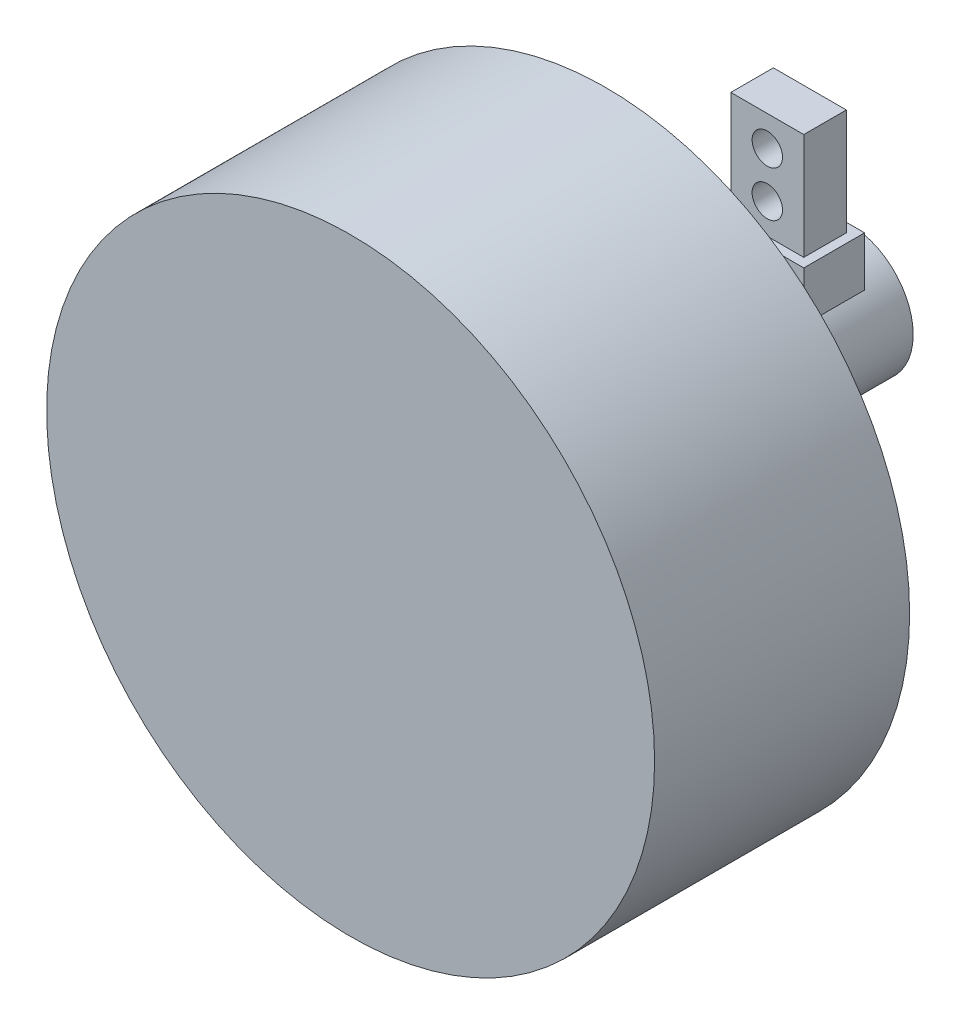
ISO-10303-21;
HEADER;
FILE_DESCRIPTION(('STEP AP214'),'2;1');
FILE_NAME('part.step','',(''),(''),'','','');
FILE_SCHEMA(('AUTOMOTIVE_DESIGN { 1 0 10303 214 1 1 1 1 }'));
ENDSEC;
DATA;
#1=APPLICATION_CONTEXT('core data for automotive mechanical design processes');
#2=APPLICATION_PROTOCOL_DEFINITION('international standard','automotive_design',2000,#1);
#3=PRODUCT_CONTEXT('',#1,'mechanical');
#4=PRODUCT('Part','Part','',(#3));
#5=PRODUCT_RELATED_PRODUCT_CATEGORY('part','',(#4));
#6=PRODUCT_DEFINITION_FORMATION('','',#4);
#7=PRODUCT_DEFINITION_CONTEXT('part definition',#1,'design');
#8=PRODUCT_DEFINITION('design','',#6,#7);
#9=PRODUCT_DEFINITION_SHAPE('','',#8);
#10=(LENGTH_UNIT() NAMED_UNIT(*) SI_UNIT(.MILLI.,.METRE.));
#11=(NAMED_UNIT(*) PLANE_ANGLE_UNIT() SI_UNIT($,.RADIAN.));
#12=(NAMED_UNIT(*) SI_UNIT($,.STERADIAN.) SOLID_ANGLE_UNIT());
#13=UNCERTAINTY_MEASURE_WITH_UNIT(LENGTH_MEASURE(1.E-05),#10,'distance_accuracy_value','');
#14=(GEOMETRIC_REPRESENTATION_CONTEXT(3) GLOBAL_UNCERTAINTY_ASSIGNED_CONTEXT((#13)) GLOBAL_UNIT_ASSIGNED_CONTEXT((#10,
#11,#12)) REPRESENTATION_CONTEXT('',''));
#15=CARTESIAN_POINT('',(0.,0.,0.));
#16=DIRECTION('',(0.,0.,1.));
#17=DIRECTION('',(1.,0.,0.));
#18=AXIS2_PLACEMENT_3D('',#15,#16,#17);
#19=CARTESIAN_POINT('',(-15.,65.985,-50.18));
#20=DIRECTION('',(1.,0.,0.));
#21=DIRECTION('',(0.,0.,-1.));
#22=AXIS2_PLACEMENT_3D('',#19,#20,#21);
#23=PLANE('',#22);
#24=DIRECTION('',(0.,0.,1.));
#25=VECTOR('',#24,1.);
#26=CARTESIAN_POINT('',(-15.,30.985,-70.18));
#27=LINE('',#26,#25);
#28=CARTESIAN_POINT('',(-15.,30.985,-70.18));
#29=VERTEX_POINT('',#28);
#30=CARTESIAN_POINT('',(-15.,30.985,-50.18));
#31=VERTEX_POINT('',#30);
#32=EDGE_CURVE('E142',#29,#31,#27,.T.);
#33=ORIENTED_EDGE('',*,*,#32,.F.);
#34=DIRECTION('',(0.,-1.,0.));
#35=VECTOR('',#34,1.);
#36=CARTESIAN_POINT('',(-15.,65.985,-70.18));
#37=LINE('',#36,#35);
#38=CARTESIAN_POINT('',(-15.,14.675497436203,-70.18));
#39=VERTEX_POINT('',#38);
#40=EDGE_CURVE('E159',#29,#39,#37,.T.);
#41=ORIENTED_EDGE('',*,*,#40,.T.);
#42=DIRECTION('',(0.,0.,1.));
#43=VECTOR('',#42,1.);
#44=CARTESIAN_POINT('',(-15.,14.675497436203,-80.18));
#45=LINE('',#44,#43);
#46=CARTESIAN_POINT('',(-15.,14.675497436203,-50.18));
#47=VERTEX_POINT('',#46);
#48=EDGE_CURVE('E160',#47,#39,#45,.F.);
#49=ORIENTED_EDGE('',*,*,#48,.F.);
#50=DIRECTION('',(0.,-1.,0.));
#51=VECTOR('',#50,1.);
#52=CARTESIAN_POINT('',(-15.,65.985,-50.18));
#53=LINE('',#52,#51);
#54=EDGE_CURVE('E170',#31,#47,#53,.T.);
#55=ORIENTED_EDGE('',*,*,#54,.F.);
#56=EDGE_LOOP('',(#33,#41,#49,#55));
#57=FACE_BOUND('',#56,.T.);
#58=ADVANCED_FACE('F36',(#57),#23,.F.);
#59=CARTESIAN_POINT('',(15.,65.985,-50.18));
#60=DIRECTION('',(0.,0.,-1.));
#61=DIRECTION('',(-1.,0.,0.));
#62=AXIS2_PLACEMENT_3D('',#59,#60,#61);
#63=PLANE('',#62);
#64=DIRECTION('',(1.,0.,0.));
#65=VECTOR('',#64,1.);
#66=CARTESIAN_POINT('',(-15.,30.985,-50.18));
#67=LINE('',#66,#65);
#68=CARTESIAN_POINT('',(15.,30.985,-50.18));
#69=VERTEX_POINT('',#68);
#70=EDGE_CURVE('E147',#31,#69,#67,.T.);
#71=ORIENTED_EDGE('',*,*,#70,.F.);
#72=ORIENTED_EDGE('',*,*,#54,.T.);
#73=CARTESIAN_POINT('',(0.,0.,-50.18));
#74=DIRECTION('',(0.,0.,1.));
#75=DIRECTION('',(1.,0.,0.));
#76=AXIS2_PLACEMENT_3D('',#73,#74,#75);
#77=CIRCLE('',#76,20.985);
#78=CARTESIAN_POINT('',(15.,14.675497436203,-50.18));
#79=VERTEX_POINT('',#78);
#80=EDGE_CURVE('E156',#79,#47,#77,.T.);
#81=ORIENTED_EDGE('',*,*,#80,.F.);
#82=DIRECTION('',(0.,-1.,0.));
#83=VECTOR('',#82,1.);
#84=CARTESIAN_POINT('',(15.,65.985,-50.18));
#85=LINE('',#84,#83);
#86=EDGE_CURVE('E168',#69,#79,#85,.T.);
#87=ORIENTED_EDGE('',*,*,#86,.F.);
#88=EDGE_LOOP('',(#71,#72,#81,#87));
#89=FACE_BOUND('',#88,.T.);
#90=ADVANCED_FACE('F194',(#89),#63,.F.);
#91=CARTESIAN_POINT('',(15.,65.985,-50.18));
#92=DIRECTION('',(-1.,0.,0.));
#93=DIRECTION('',(0.,0.,1.));
#94=AXIS2_PLACEMENT_3D('',#91,#92,#93);
#95=PLANE('',#94);
#96=DIRECTION('',(0.,0.,-1.));
#97=VECTOR('',#96,1.);
#98=CARTESIAN_POINT('',(15.,30.985,-70.18));
#99=LINE('',#98,#97);
#100=CARTESIAN_POINT('',(15.,30.985,-70.18));
#101=VERTEX_POINT('',#100);
#102=EDGE_CURVE('E51',#69,#101,#99,.T.);
#103=ORIENTED_EDGE('',*,*,#102,.F.);
#104=ORIENTED_EDGE('',*,*,#86,.T.);
#105=DIRECTION('',(0.,0.,1.));
#106=VECTOR('',#105,1.);
#107=CARTESIAN_POINT('',(15.,14.675497436203,-80.18));
#108=LINE('',#107,#106);
#109=CARTESIAN_POINT('',(15.,14.675497436203,-70.18));
#110=VERTEX_POINT('',#109);
#111=EDGE_CURVE('E152',#110,#79,#108,.T.);
#112=ORIENTED_EDGE('',*,*,#111,.F.);
#113=DIRECTION('',(0.,-1.,0.));
#114=VECTOR('',#113,1.);
#115=CARTESIAN_POINT('',(15.,65.985,-70.18));
#116=LINE('',#115,#114);
#117=EDGE_CURVE('E166',#101,#110,#116,.T.);
#118=ORIENTED_EDGE('',*,*,#117,.F.);
#119=EDGE_LOOP('',(#103,#104,#112,#118));
#120=FACE_BOUND('',#119,.T.);
#121=ADVANCED_FACE('F203',(#120),#95,.F.);
#122=CARTESIAN_POINT('',(15.,65.985,-70.18));
#123=DIRECTION('',(0.,0.,1.));
#124=DIRECTION('',(1.,0.,0.));
#125=AXIS2_PLACEMENT_3D('',#122,#123,#124);
#126=PLANE('',#125);
#127=DIRECTION('',(-1.,0.,0.));
#128=VECTOR('',#127,1.);
#129=CARTESIAN_POINT('',(-15.,30.985,-70.18));
#130=LINE('',#129,#128);
#131=EDGE_CURVE('E150',#101,#29,#130,.T.);
#132=ORIENTED_EDGE('',*,*,#131,.F.);
#133=ORIENTED_EDGE('',*,*,#117,.T.);
#134=CARTESIAN_POINT('',(0.,0.,-70.18));
#135=DIRECTION('',(0.,0.,-1.));
#136=DIRECTION('',(-1.,0.,0.));
#137=AXIS2_PLACEMENT_3D('',#134,#135,#136);
#138=CIRCLE('',#137,20.985);
#139=EDGE_CURVE('E155',#39,#110,#138,.T.);
#140=ORIENTED_EDGE('',*,*,#139,.F.);
#141=ORIENTED_EDGE('',*,*,#40,.F.);
#142=EDGE_LOOP('',(#132,#133,#140,#141));
#143=FACE_BOUND('',#142,.T.);
#144=ADVANCED_FACE('F185',(#143),#126,.F.);
#145=CARTESIAN_POINT('',(0.,0.,-80.18));
#146=DIRECTION('',(0.,0.,1.));
#147=DIRECTION('',(1.,0.,0.));
#148=AXIS2_PLACEMENT_3D('',#145,#146,#147);
#149=CYLINDRICAL_SURFACE('',#148,20.985);
#150=CARTESIAN_POINT('',(0.,0.,-80.18));
#151=DIRECTION('',(0.,0.,1.));
#152=DIRECTION('',(1.,0.,0.));
#153=AXIS2_PLACEMENT_3D('',#150,#151,#152);
#154=CIRCLE('',#153,20.985);
#155=CARTESIAN_POINT('',(20.985,0.,-80.18));
#156=VERTEX_POINT('',#155);
#157=EDGE_CURVE('E173',#156,#156,#154,.T.);
#158=ORIENTED_EDGE('',*,*,#157,.T.);
#159=EDGE_LOOP('',(#158));
#160=FACE_BOUND('',#159,.T.);
#161=CARTESIAN_POINT('',(0.,0.,0.));
#162=DIRECTION('',(0.,0.,1.));
#163=DIRECTION('',(1.,0.,0.));
#164=AXIS2_PLACEMENT_3D('',#161,#162,#163);
#165=CIRCLE('',#164,20.985);
#166=CARTESIAN_POINT('',(20.985,0.,0.));
#167=VERTEX_POINT('',#166);
#168=EDGE_CURVE('E172',#167,#167,#165,.T.);
#169=ORIENTED_EDGE('',*,*,#168,.F.);
#170=EDGE_LOOP('',(#169));
#171=FACE_BOUND('',#170,.T.);
#172=ORIENTED_EDGE('',*,*,#80,.T.);
#173=ORIENTED_EDGE('',*,*,#48,.T.);
#174=ORIENTED_EDGE('',*,*,#139,.T.);
#175=ORIENTED_EDGE('',*,*,#111,.T.);
#176=EDGE_LOOP('',(#172,#173,#174,#175));
#177=FACE_BOUND('',#176,.T.);
#178=ADVANCED_FACE('F182',(#160,#171,#177),#149,.T.);
#179=CARTESIAN_POINT('',(0.,0.,83.89));
#180=DIRECTION('',(0.,0.,-1.));
#181=DIRECTION('',(-1.,0.,0.));
#182=AXIS2_PLACEMENT_3D('',#179,#180,#181);
#183=CYLINDRICAL_SURFACE('',#182,100.);
#184=CARTESIAN_POINT('',(0.,0.,83.89));
#185=DIRECTION('',(0.,0.,1.));
#186=DIRECTION('',(1.,0.,0.));
#187=AXIS2_PLACEMENT_3D('',#184,#185,#186);
#188=CIRCLE('',#187,100.);
#189=CARTESIAN_POINT('',(100.,0.,83.89));
#190=VERTEX_POINT('',#189);
#191=EDGE_CURVE('E11',#190,#190,#188,.T.);
#192=ORIENTED_EDGE('',*,*,#191,.F.);
#193=EDGE_LOOP('',(#192));
#194=FACE_BOUND('',#193,.T.);
#195=CARTESIAN_POINT('',(0.,0.,0.));
#196=DIRECTION('',(0.,0.,1.));
#197=DIRECTION('',(1.,0.,0.));
#198=AXIS2_PLACEMENT_3D('',#195,#196,#197);
#199=CIRCLE('',#198,100.);
#200=CARTESIAN_POINT('',(100.,0.,0.));
#201=VERTEX_POINT('',#200);
#202=EDGE_CURVE('E40',#201,#201,#199,.T.);
#203=ORIENTED_EDGE('',*,*,#202,.T.);
#204=EDGE_LOOP('',(#203));
#205=FACE_BOUND('',#204,.T.);
#206=ADVANCED_FACE('F38',(#194,#205),#183,.T.);
#207=CARTESIAN_POINT('',(0.,0.,83.89));
#208=DIRECTION('',(0.,0.,1.));
#209=DIRECTION('',(1.,0.,0.));
#210=AXIS2_PLACEMENT_3D('',#207,#208,#209);
#211=PLANE('',#210);
#212=ORIENTED_EDGE('',*,*,#191,.T.);
#213=EDGE_LOOP('',(#212));
#214=FACE_BOUND('',#213,.T.);
#215=ADVANCED_FACE('F221',(#214),#211,.T.);
#216=CARTESIAN_POINT('',(0.,0.,0.));
#217=DIRECTION('',(0.,0.,1.));
#218=DIRECTION('',(1.,0.,0.));
#219=AXIS2_PLACEMENT_3D('',#216,#217,#218);
#220=PLANE('',#219);
#221=ORIENTED_EDGE('',*,*,#168,.T.);
#222=EDGE_LOOP('',(#221));
#223=FACE_BOUND('',#222,.T.);
#224=ORIENTED_EDGE('',*,*,#202,.F.);
#225=EDGE_LOOP('',(#224));
#226=FACE_BOUND('',#225,.T.);
#227=ADVANCED_FACE('F179',(#223,#226),#220,.F.);
#228=CARTESIAN_POINT('',(0.,0.,-80.18));
#229=DIRECTION('',(0.,0.,1.));
#230=DIRECTION('',(1.,0.,0.));
#231=AXIS2_PLACEMENT_3D('',#228,#229,#230);
#232=PLANE('',#231);
#233=ORIENTED_EDGE('',*,*,#157,.F.);
#234=EDGE_LOOP('',(#233));
#235=FACE_BOUND('',#234,.T.);
#236=ADVANCED_FACE('F217',(#235),#232,.F.);
#237=CARTESIAN_POINT('',(0.,30.985,0.));
#238=DIRECTION('',(0.,1.,0.));
#239=DIRECTION('',(0.,0.,1.));
#240=AXIS2_PLACEMENT_3D('',#237,#238,#239);
#241=PLANE('',#240);
#242=DIRECTION('',(-1.,0.,0.));
#243=VECTOR('',#242,1.);
#244=CARTESIAN_POINT('',(12.,30.985,-67.18));
#245=LINE('',#244,#243);
#246=CARTESIAN_POINT('',(12.,30.985,-67.18));
#247=VERTEX_POINT('',#246);
#248=CARTESIAN_POINT('',(-12.,30.985,-67.18));
#249=VERTEX_POINT('',#248);
#250=EDGE_CURVE('E113',#247,#249,#245,.T.);
#251=ORIENTED_EDGE('',*,*,#250,.F.);
#252=DIRECTION('',(0.,0.,-1.));
#253=VECTOR('',#252,1.);
#254=CARTESIAN_POINT('',(12.,30.985,-53.18));
#255=LINE('',#254,#253);
#256=CARTESIAN_POINT('',(12.,30.985,-53.18));
#257=VERTEX_POINT('',#256);
#258=EDGE_CURVE('E122',#257,#247,#255,.T.);
#259=ORIENTED_EDGE('',*,*,#258,.F.);
#260=DIRECTION('',(1.,0.,0.));
#261=VECTOR('',#260,1.);
#262=CARTESIAN_POINT('',(12.,30.985,-53.18));
#263=LINE('',#262,#261);
#264=CARTESIAN_POINT('',(-12.,30.985,-53.18));
#265=VERTEX_POINT('',#264);
#266=EDGE_CURVE('E105',#265,#257,#263,.T.);
#267=ORIENTED_EDGE('',*,*,#266,.F.);
#268=DIRECTION('',(0.,0.,1.));
#269=VECTOR('',#268,1.);
#270=CARTESIAN_POINT('',(-12.,30.985,-53.18));
#271=LINE('',#270,#269);
#272=EDGE_CURVE('E119',#249,#265,#271,.T.);
#273=ORIENTED_EDGE('',*,*,#272,.F.);
#274=EDGE_LOOP('',(#251,#259,#267,#273));
#275=FACE_BOUND('',#274,.T.);
#276=ORIENTED_EDGE('',*,*,#32,.T.);
#277=ORIENTED_EDGE('',*,*,#70,.T.);
#278=ORIENTED_EDGE('',*,*,#102,.T.);
#279=ORIENTED_EDGE('',*,*,#131,.T.);
#280=EDGE_LOOP('',(#276,#277,#278,#279));
#281=FACE_BOUND('',#280,.T.);
#282=ADVANCED_FACE('F118',(#275,#281),#241,.T.);
#283=CARTESIAN_POINT('',(-12.,30.985,-53.18));
#284=DIRECTION('',(-1.,0.,0.));
#285=DIRECTION('',(0.,0.,1.));
#286=AXIS2_PLACEMENT_3D('',#283,#284,#285);
#287=PLANE('',#286);
#288=DIRECTION('',(0.,0.,1.));
#289=VECTOR('',#288,1.);
#290=CARTESIAN_POINT('',(-12.,65.985,-53.18));
#291=LINE('',#290,#289);
#292=CARTESIAN_POINT('',(-12.,65.985,-67.18));
#293=VERTEX_POINT('',#292);
#294=CARTESIAN_POINT('',(-12.,65.985,-53.18));
#295=VERTEX_POINT('',#294);
#296=EDGE_CURVE('E136',#293,#295,#291,.T.);
#297=ORIENTED_EDGE('',*,*,#296,.F.);
#298=DIRECTION('',(0.,1.,0.));
#299=VECTOR('',#298,1.);
#300=CARTESIAN_POINT('',(-12.,30.985,-67.18));
#301=LINE('',#300,#299);
#302=EDGE_CURVE('E125',#249,#293,#301,.T.);
#303=ORIENTED_EDGE('',*,*,#302,.F.);
#304=ORIENTED_EDGE('',*,*,#272,.T.);
#305=DIRECTION('',(0.,1.,0.));
#306=VECTOR('',#305,1.);
#307=CARTESIAN_POINT('',(-12.,30.985,-53.18));
#308=LINE('',#307,#306);
#309=EDGE_CURVE('E102',#265,#295,#308,.T.);
#310=ORIENTED_EDGE('',*,*,#309,.T.);
#311=EDGE_LOOP('',(#297,#303,#304,#310));
#312=FACE_BOUND('',#311,.T.);
#313=ADVANCED_FACE('F124',(#312),#287,.T.);
#314=CARTESIAN_POINT('',(12.,30.985,-67.18));
#315=DIRECTION('',(0.,0.,-1.));
#316=DIRECTION('',(-1.,0.,0.));
#317=AXIS2_PLACEMENT_3D('',#314,#315,#316);
#318=PLANE('',#317);
#319=CARTESIAN_POINT('',(0.,40.985,-67.18));
#320=DIRECTION('',(0.,0.,-1.));
#321=DIRECTION('',(-1.,0.,0.));
#322=AXIS2_PLACEMENT_3D('',#319,#320,#321);
#323=CIRCLE('',#322,5.);
#324=CARTESIAN_POINT('',(-5.,40.985,-67.18));
#325=VERTEX_POINT('',#324);
#326=EDGE_CURVE('E394',#325,#325,#323,.T.);
#327=ORIENTED_EDGE('',*,*,#326,.F.);
#328=EDGE_LOOP('',(#327));
#329=FACE_BOUND('',#328,.T.);
#330=CARTESIAN_POINT('',(0.,55.985,-67.18));
#331=DIRECTION('',(0.,0.,-1.));
#332=DIRECTION('',(-1.,0.,0.));
#333=AXIS2_PLACEMENT_3D('',#330,#331,#332);
#334=CIRCLE('',#333,5.);
#335=CARTESIAN_POINT('',(-5.,55.985,-67.18));
#336=VERTEX_POINT('',#335);
#337=EDGE_CURVE('E395',#336,#336,#334,.T.);
#338=ORIENTED_EDGE('',*,*,#337,.F.);
#339=EDGE_LOOP('',(#338));
#340=FACE_BOUND('',#339,.T.);
#341=DIRECTION('',(-1.,0.,0.));
#342=VECTOR('',#341,1.);
#343=CARTESIAN_POINT('',(12.,65.985,-67.18));
#344=LINE('',#343,#342);
#345=CARTESIAN_POINT('',(12.,65.985,-67.18));
#346=VERTEX_POINT('',#345);
#347=EDGE_CURVE('E126',#346,#293,#344,.T.);
#348=ORIENTED_EDGE('',*,*,#347,.F.);
#349=DIRECTION('',(0.,1.,0.));
#350=VECTOR('',#349,1.);
#351=CARTESIAN_POINT('',(12.,30.985,-67.18));
#352=LINE('',#351,#350);
#353=EDGE_CURVE('E143',#247,#346,#352,.T.);
#354=ORIENTED_EDGE('',*,*,#353,.F.);
#355=ORIENTED_EDGE('',*,*,#250,.T.);
#356=ORIENTED_EDGE('',*,*,#302,.T.);
#357=EDGE_LOOP('',(#348,#354,#355,#356));
#358=FACE_BOUND('',#357,.T.);
#359=ADVANCED_FACE('F248',(#329,#340,#358),#318,.T.);
#360=CARTESIAN_POINT('',(12.,30.985,-53.18));
#361=DIRECTION('',(1.,0.,0.));
#362=DIRECTION('',(0.,0.,-1.));
#363=AXIS2_PLACEMENT_3D('',#360,#361,#362);
#364=PLANE('',#363);
#365=DIRECTION('',(0.,0.,-1.));
#366=VECTOR('',#365,1.);
#367=CARTESIAN_POINT('',(12.,65.985,-53.18));
#368=LINE('',#367,#366);
#369=CARTESIAN_POINT('',(12.,65.985,-53.18));
#370=VERTEX_POINT('',#369);
#371=EDGE_CURVE('E59',#370,#346,#368,.T.);
#372=ORIENTED_EDGE('',*,*,#371,.F.);
#373=DIRECTION('',(0.,1.,0.));
#374=VECTOR('',#373,1.);
#375=CARTESIAN_POINT('',(12.,30.985,-53.18));
#376=LINE('',#375,#374);
#377=EDGE_CURVE('E112',#257,#370,#376,.T.);
#378=ORIENTED_EDGE('',*,*,#377,.F.);
#379=ORIENTED_EDGE('',*,*,#258,.T.);
#380=ORIENTED_EDGE('',*,*,#353,.T.);
#381=EDGE_LOOP('',(#372,#378,#379,#380));
#382=FACE_BOUND('',#381,.T.);
#383=ADVANCED_FACE('F256',(#382),#364,.T.);
#384=CARTESIAN_POINT('',(12.,30.985,-53.18));
#385=DIRECTION('',(0.,0.,1.));
#386=DIRECTION('',(1.,0.,0.));
#387=AXIS2_PLACEMENT_3D('',#384,#385,#386);
#388=PLANE('',#387);
#389=CARTESIAN_POINT('',(0.,40.985,-53.18));
#390=DIRECTION('',(0.,0.,1.));
#391=DIRECTION('',(1.,0.,0.));
#392=AXIS2_PLACEMENT_3D('',#389,#390,#391);
#393=CIRCLE('',#392,5.);
#394=CARTESIAN_POINT('',(5.,40.985,-53.18));
#395=VERTEX_POINT('',#394);
#396=EDGE_CURVE('E138',#395,#395,#393,.F.);
#397=ORIENTED_EDGE('',*,*,#396,.T.);
#398=EDGE_LOOP('',(#397));
#399=FACE_BOUND('',#398,.T.);
#400=CARTESIAN_POINT('',(0.,55.985,-53.18));
#401=DIRECTION('',(0.,0.,1.));
#402=DIRECTION('',(1.,0.,0.));
#403=AXIS2_PLACEMENT_3D('',#400,#401,#402);
#404=CIRCLE('',#403,5.);
#405=CARTESIAN_POINT('',(5.,55.985,-53.18));
#406=VERTEX_POINT('',#405);
#407=EDGE_CURVE('E131',#406,#406,#404,.F.);
#408=ORIENTED_EDGE('',*,*,#407,.T.);
#409=EDGE_LOOP('',(#408));
#410=FACE_BOUND('',#409,.T.);
#411=DIRECTION('',(1.,0.,0.));
#412=VECTOR('',#411,1.);
#413=CARTESIAN_POINT('',(12.,65.985,-53.18));
#414=LINE('',#413,#412);
#415=EDGE_CURVE('E107',#295,#370,#414,.T.);
#416=ORIENTED_EDGE('',*,*,#415,.F.);
#417=ORIENTED_EDGE('',*,*,#309,.F.);
#418=ORIENTED_EDGE('',*,*,#266,.T.);
#419=ORIENTED_EDGE('',*,*,#377,.T.);
#420=EDGE_LOOP('',(#416,#417,#418,#419));
#421=FACE_BOUND('',#420,.T.);
#422=ADVANCED_FACE('F104',(#399,#410,#421),#388,.T.);
#423=CARTESIAN_POINT('',(0.,65.985,0.));
#424=DIRECTION('',(0.,1.,0.));
#425=DIRECTION('',(0.,0.,1.));
#426=AXIS2_PLACEMENT_3D('',#423,#424,#425);
#427=PLANE('',#426);
#428=ORIENTED_EDGE('',*,*,#347,.T.);
#429=ORIENTED_EDGE('',*,*,#296,.T.);
#430=ORIENTED_EDGE('',*,*,#415,.T.);
#431=ORIENTED_EDGE('',*,*,#371,.T.);
#432=EDGE_LOOP('',(#428,#429,#430,#431));
#433=FACE_BOUND('',#432,.T.);
#434=ADVANCED_FACE('F270',(#433),#427,.T.);
#435=CARTESIAN_POINT('',(0.,55.985,83.891));
#436=DIRECTION('',(0.,0.,-1.));
#437=DIRECTION('',(-1.,0.,0.));
#438=AXIS2_PLACEMENT_3D('',#435,#436,#437);
#439=CYLINDRICAL_SURFACE('',#438,5.);
#440=ORIENTED_EDGE('',*,*,#407,.F.);
#441=EDGE_LOOP('',(#440));
#442=FACE_BOUND('',#441,.T.);
#443=ORIENTED_EDGE('',*,*,#337,.T.);
#444=EDGE_LOOP('',(#443));
#445=FACE_BOUND('',#444,.T.);
#446=ADVANCED_FACE('F278',(#442,#445),#439,.F.);
#447=CARTESIAN_POINT('',(0.,40.985,83.891));
#448=DIRECTION('',(0.,0.,-1.));
#449=DIRECTION('',(-1.,0.,0.));
#450=AXIS2_PLACEMENT_3D('',#447,#448,#449);
#451=CYLINDRICAL_SURFACE('',#450,5.);
#452=ORIENTED_EDGE('',*,*,#396,.F.);
#453=EDGE_LOOP('',(#452));
#454=FACE_BOUND('',#453,.T.);
#455=ORIENTED_EDGE('',*,*,#326,.T.);
#456=EDGE_LOOP('',(#455));
#457=FACE_BOUND('',#456,.T.);
#458=ADVANCED_FACE('F285',(#454,#457),#451,.F.);
#459=CLOSED_SHELL('',(#58,#90,#121,#144,#178,#206,#215,#227,#236,#282,#313,#359,#383,#422,#434,
#446,#458));
#460=MANIFOLD_SOLID_BREP('B2',#459);
#461=ADVANCED_BREP_SHAPE_REPRESENTATION('',(#18,#460),#14);
#462=SHAPE_DEFINITION_REPRESENTATION(#9,#461);
ENDSEC;
END-ISO-10303-21;
